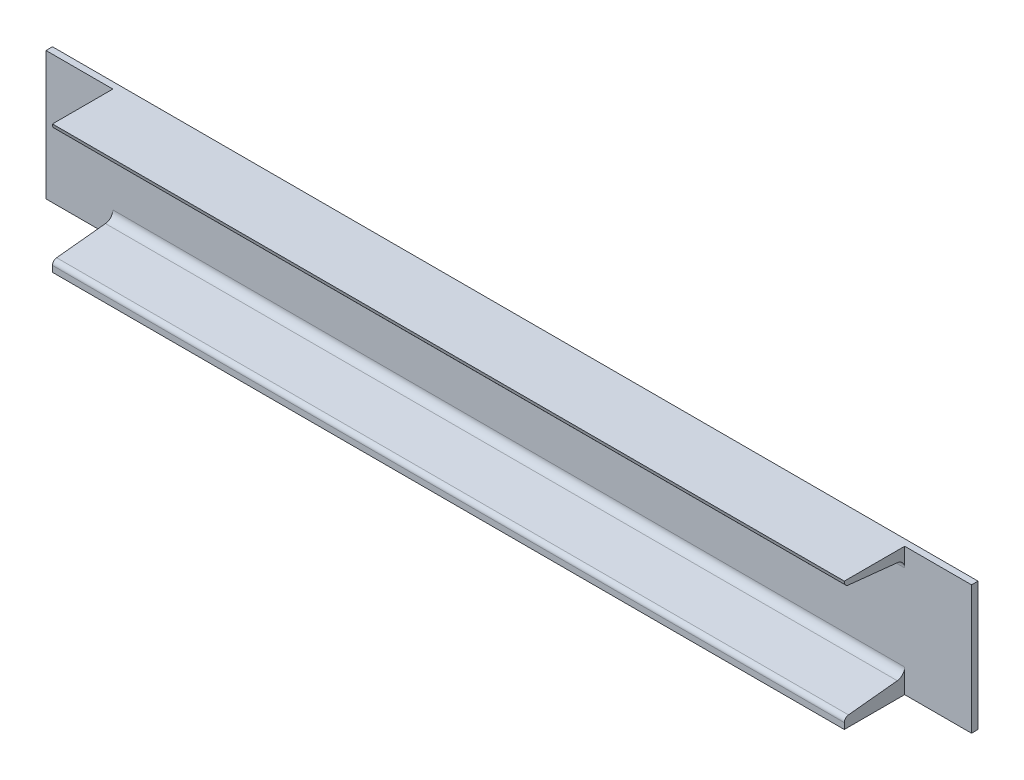
ISO-10303-21;
HEADER;
FILE_DESCRIPTION(('STEP AP214'),'2;1');
FILE_NAME('part.step','',(''),(''),'','','');
FILE_SCHEMA(('AUTOMOTIVE_DESIGN { 1 0 10303 214 1 1 1 1 }'));
ENDSEC;
DATA;
#1=APPLICATION_CONTEXT('core data for automotive mechanical design processes');
#2=APPLICATION_PROTOCOL_DEFINITION('international standard','automotive_design',2000,#1);
#3=PRODUCT_CONTEXT('',#1,'mechanical');
#4=PRODUCT('Part','Part','',(#3));
#5=PRODUCT_RELATED_PRODUCT_CATEGORY('part','',(#4));
#6=PRODUCT_DEFINITION_FORMATION('','',#4);
#7=PRODUCT_DEFINITION_CONTEXT('part definition',#1,'design');
#8=PRODUCT_DEFINITION('design','',#6,#7);
#9=PRODUCT_DEFINITION_SHAPE('','',#8);
#10=(LENGTH_UNIT() NAMED_UNIT(*) SI_UNIT(.MILLI.,.METRE.));
#11=(NAMED_UNIT(*) PLANE_ANGLE_UNIT() SI_UNIT($,.RADIAN.));
#12=(NAMED_UNIT(*) SI_UNIT($,.STERADIAN.) SOLID_ANGLE_UNIT());
#13=UNCERTAINTY_MEASURE_WITH_UNIT(LENGTH_MEASURE(1.E-05),#10,'distance_accuracy_value','');
#14=(GEOMETRIC_REPRESENTATION_CONTEXT(3) GLOBAL_UNCERTAINTY_ASSIGNED_CONTEXT((#13)) GLOBAL_UNIT_ASSIGNED_CONTEXT((#10,
#11,#12)) REPRESENTATION_CONTEXT('',''));
#15=CARTESIAN_POINT('',(0.,0.,0.));
#16=DIRECTION('',(0.,0.,1.));
#17=DIRECTION('',(1.,0.,0.));
#18=AXIS2_PLACEMENT_3D('',#15,#16,#17);
#19=CARTESIAN_POINT('',(-900.,124.164669163818,60.5000000000001));
#20=DIRECTION('',(1.,0.,0.));
#21=DIRECTION('',(0.,0.,-1.));
#22=AXIS2_PLACEMENT_3D('',#19,#20,#21);
#23=CYLINDRICAL_SURFACE('',#22,4.5);
#24=CARTESIAN_POINT('',(-835.,124.164669163818,60.5000000000001));
#25=DIRECTION('',(-1.,0.,0.));
#26=DIRECTION('',(0.,0.,1.));
#27=AXIS2_PLACEMENT_3D('',#24,#25,#26);
#28=CIRCLE('',#27,4.5);
#29=CARTESIAN_POINT('',(-835.,119.689320634661,60.9703780847045));
#30=VERTEX_POINT('',#29);
#31=CARTESIAN_POINT('',(-835.,124.164669163818,65.0000000000001));
#32=VERTEX_POINT('',#31);
#33=EDGE_CURVE('E356',#30,#32,#28,.T.);
#34=ORIENTED_EDGE('',*,*,#33,.F.);
#35=DIRECTION('',(1.,0.,0.));
#36=VECTOR('',#35,1.);
#37=CARTESIAN_POINT('',(-900.,119.689320634661,60.9703780847045));
#38=LINE('',#37,#36);
#39=CARTESIAN_POINT('',(-65.0000000000001,119.689320634661,60.9703780847045));
#40=VERTEX_POINT('',#39);
#41=EDGE_CURVE('E199',#30,#40,#38,.T.);
#42=ORIENTED_EDGE('',*,*,#41,.T.);
#43=CARTESIAN_POINT('',(-65.0000000000001,124.164669163818,60.5));
#44=DIRECTION('',(1.,0.,0.));
#45=DIRECTION('',(0.,0.,-1.));
#46=AXIS2_PLACEMENT_3D('',#43,#44,#45);
#47=CIRCLE('',#46,4.5);
#48=CARTESIAN_POINT('',(-65.0000000000001,124.164669163818,65.));
#49=VERTEX_POINT('',#48);
#50=EDGE_CURVE('E266',#49,#40,#47,.T.);
#51=ORIENTED_EDGE('',*,*,#50,.F.);
#52=DIRECTION('',(1.,0.,0.));
#53=VECTOR('',#52,1.);
#54=CARTESIAN_POINT('',(-900.,124.164669163818,65.0000000000001));
#55=LINE('',#54,#53);
#56=EDGE_CURVE('E86',#32,#49,#55,.T.);
#57=ORIENTED_EDGE('',*,*,#56,.F.);
#58=EDGE_LOOP('',(#34,#42,#51,#57));
#59=FACE_BOUND('',#58,.T.);
#60=ADVANCED_FACE('F79',(#59),#23,.T.);
#61=CARTESIAN_POINT('',(-900.,125.,65.0000000000001));
#62=DIRECTION('',(0.,0.,-1.));
#63=DIRECTION('',(-1.,0.,0.));
#64=AXIS2_PLACEMENT_3D('',#61,#62,#63);
#65=PLANE('',#64);
#66=DIRECTION('',(0.,1.,0.));
#67=VECTOR('',#66,1.);
#68=CARTESIAN_POINT('',(-835.,125.,65.0000000000001));
#69=LINE('',#68,#67);
#70=CARTESIAN_POINT('',(-835.,125.,65.0000000000001));
#71=VERTEX_POINT('',#70);
#72=EDGE_CURVE('E258',#32,#71,#69,.T.);
#73=ORIENTED_EDGE('',*,*,#72,.F.);
#74=ORIENTED_EDGE('',*,*,#56,.T.);
#75=DIRECTION('',(0.,-1.,0.));
#76=VECTOR('',#75,1.);
#77=CARTESIAN_POINT('',(-65.0000000000001,125.,65.));
#78=LINE('',#77,#76);
#79=CARTESIAN_POINT('',(-65.0000000000001,125.,65.));
#80=VERTEX_POINT('',#79);
#81=EDGE_CURVE('E257',#80,#49,#78,.T.);
#82=ORIENTED_EDGE('',*,*,#81,.F.);
#83=DIRECTION('',(1.,0.,0.));
#84=VECTOR('',#83,1.);
#85=CARTESIAN_POINT('',(-900.,125.,65.0000000000001));
#86=LINE('',#85,#84);
#87=EDGE_CURVE('E249',#71,#80,#86,.T.);
#88=ORIENTED_EDGE('',*,*,#87,.F.);
#89=EDGE_LOOP('',(#73,#74,#82,#88));
#90=FACE_BOUND('',#89,.T.);
#91=ADVANCED_FACE('F255',(#90),#65,.F.);
#92=CARTESIAN_POINT('',(-900.,0.,65.0000000000001));
#93=DIRECTION('',(0.,0.,-1.));
#94=DIRECTION('',(0.,1.,0.));
#95=AXIS2_PLACEMENT_3D('',#92,#93,#94);
#96=PLANE('',#95);
#97=DIRECTION('',(0.,1.,0.));
#98=VECTOR('',#97,1.);
#99=CARTESIAN_POINT('',(-835.,0.,65.0000000000001));
#100=LINE('',#99,#98);
#101=CARTESIAN_POINT('',(-835.,0.,65.0000000000001));
#102=VERTEX_POINT('',#101);
#103=CARTESIAN_POINT('',(-835.,5.84533083618209,65.0000000000001));
#104=VERTEX_POINT('',#103);
#105=EDGE_CURVE('E543',#102,#104,#100,.T.);
#106=ORIENTED_EDGE('',*,*,#105,.F.);
#107=DIRECTION('',(1.,0.,0.));
#108=VECTOR('',#107,1.);
#109=CARTESIAN_POINT('',(-900.,0.,65.0000000000001));
#110=LINE('',#109,#108);
#111=CARTESIAN_POINT('',(-65.0000000000001,0.,65.));
#112=VERTEX_POINT('',#111);
#113=EDGE_CURVE('E242',#102,#112,#110,.T.);
#114=ORIENTED_EDGE('',*,*,#113,.T.);
#115=DIRECTION('',(0.,-1.,0.));
#116=VECTOR('',#115,1.);
#117=CARTESIAN_POINT('',(-65.0000000000001,0.,65.));
#118=LINE('',#117,#116);
#119=CARTESIAN_POINT('',(-65.0000000000001,5.84533083618209,65.));
#120=VERTEX_POINT('',#119);
#121=EDGE_CURVE('E290',#120,#112,#118,.T.);
#122=ORIENTED_EDGE('',*,*,#121,.F.);
#123=DIRECTION('',(1.,0.,0.));
#124=VECTOR('',#123,1.);
#125=CARTESIAN_POINT('',(-900.,5.84533083618209,65.0000000000001));
#126=LINE('',#125,#124);
#127=EDGE_CURVE('E240',#104,#120,#126,.T.);
#128=ORIENTED_EDGE('',*,*,#127,.F.);
#129=EDGE_LOOP('',(#106,#114,#122,#128));
#130=FACE_BOUND('',#129,.T.);
#131=ADVANCED_FACE('F318',(#130),#96,.F.);
#132=CARTESIAN_POINT('',(-900.,5.84533083618209,60.5000000000001));
#133=DIRECTION('',(1.,0.,0.));
#134=DIRECTION('',(0.,0.,-1.));
#135=AXIS2_PLACEMENT_3D('',#132,#133,#134);
#136=CYLINDRICAL_SURFACE('',#135,4.5);
#137=CARTESIAN_POINT('',(-835.,5.84533083618209,60.5000000000001));
#138=DIRECTION('',(-1.,0.,0.));
#139=DIRECTION('',(0.,0.,1.));
#140=AXIS2_PLACEMENT_3D('',#137,#138,#139);
#141=CIRCLE('',#140,4.5);
#142=CARTESIAN_POINT('',(-835.,10.3206793653393,60.9703780847045));
#143=VERTEX_POINT('',#142);
#144=EDGE_CURVE('E538',#104,#143,#141,.T.);
#145=ORIENTED_EDGE('',*,*,#144,.F.);
#146=ORIENTED_EDGE('',*,*,#127,.T.);
#147=CARTESIAN_POINT('',(-65.0000000000001,5.84533083618209,60.5));
#148=DIRECTION('',(1.,0.,0.));
#149=DIRECTION('',(0.,0.,-1.));
#150=AXIS2_PLACEMENT_3D('',#147,#148,#149);
#151=CIRCLE('',#150,4.5);
#152=CARTESIAN_POINT('',(-65.0000000000001,10.3206793653393,60.9703780847045));
#153=VERTEX_POINT('',#152);
#154=EDGE_CURVE('E287',#153,#120,#151,.T.);
#155=ORIENTED_EDGE('',*,*,#154,.F.);
#156=DIRECTION('',(1.,0.,0.));
#157=VECTOR('',#156,1.);
#158=CARTESIAN_POINT('',(-900.,10.3206793653393,60.9703780847045));
#159=LINE('',#158,#157);
#160=EDGE_CURVE('E238',#143,#153,#159,.T.);
#161=ORIENTED_EDGE('',*,*,#160,.F.);
#162=EDGE_LOOP('',(#145,#146,#155,#161));
#163=FACE_BOUND('',#162,.T.);
#164=ADVANCED_FACE('F322',(#163),#136,.T.);
#165=CARTESIAN_POINT('',(-900.,15.3138248370538,13.4637722938589));
#166=DIRECTION('',(0.,-0.994521895368274,-0.104528463267647));
#167=DIRECTION('',(0.,0.104528463267647,-0.994521895368274));
#168=AXIS2_PLACEMENT_3D('',#165,#166,#167);
#169=PLANE('',#168);
#170=DIRECTION('',(0.,0.104528463267647,-0.994521895368274));
#171=VECTOR('',#170,1.);
#172=CARTESIAN_POINT('',(-835.,15.3138248370538,13.4637722938589));
#173=LINE('',#172,#171);
#174=CARTESIAN_POINT('',(-835.,15.3138248370538,13.4637722938588));
#175=VERTEX_POINT('',#174);
#176=EDGE_CURVE('E374',#143,#175,#173,.T.);
#177=ORIENTED_EDGE('',*,*,#176,.F.);
#178=ORIENTED_EDGE('',*,*,#160,.T.);
#179=DIRECTION('',(0.,-0.104528463267647,0.994521895368274));
#180=VECTOR('',#179,1.);
#181=CARTESIAN_POINT('',(-65.0000000000001,15.3138248370538,13.4637722938588));
#182=LINE('',#181,#180);
#183=CARTESIAN_POINT('',(-65.0000000000001,15.3138248370538,13.4637722938589));
#184=VERTEX_POINT('',#183);
#185=EDGE_CURVE('E284',#184,#153,#182,.T.);
#186=ORIENTED_EDGE('',*,*,#185,.F.);
#187=DIRECTION('',(1.,0.,0.));
#188=VECTOR('',#187,1.);
#189=CARTESIAN_POINT('',(-900.,15.3138248370538,13.4637722938589));
#190=LINE('',#189,#188);
#191=EDGE_CURVE('E236',#175,#184,#190,.T.);
#192=ORIENTED_EDGE('',*,*,#191,.F.);
#193=EDGE_LOOP('',(#177,#178,#186,#192));
#194=FACE_BOUND('',#193,.T.);
#195=ADVANCED_FACE('F335',(#194),#169,.F.);
#196=CARTESIAN_POINT('',(-900.,23.27,14.3000000000001));
#197=DIRECTION('',(1.,0.,0.));
#198=DIRECTION('',(0.,0.,-1.));
#199=AXIS2_PLACEMENT_3D('',#196,#197,#198);
#200=CYLINDRICAL_SURFACE('',#199,8.);
#201=CARTESIAN_POINT('',(-835.,23.27,14.3000000000001));
#202=DIRECTION('',(-1.,0.,0.));
#203=DIRECTION('',(0.,0.,1.));
#204=AXIS2_PLACEMENT_3D('',#201,#202,#203);
#205=CIRCLE('',#204,8.);
#206=CARTESIAN_POINT('',(-835.,23.27,6.30000000000011));
#207=VERTEX_POINT('',#206);
#208=EDGE_CURVE('E371',#175,#207,#205,.F.);
#209=ORIENTED_EDGE('',*,*,#208,.F.);
#210=ORIENTED_EDGE('',*,*,#191,.T.);
#211=CARTESIAN_POINT('',(-65.0000000000001,23.27,14.3));
#212=DIRECTION('',(1.,0.,0.));
#213=DIRECTION('',(0.,0.,-1.));
#214=AXIS2_PLACEMENT_3D('',#211,#212,#213);
#215=CIRCLE('',#214,8.);
#216=CARTESIAN_POINT('',(-65.,23.27,6.30000000000001));
#217=VERTEX_POINT('',#216);
#218=EDGE_CURVE('E281',#217,#184,#215,.F.);
#219=ORIENTED_EDGE('',*,*,#218,.F.);
#220=DIRECTION('',(1.,0.,0.));
#221=VECTOR('',#220,1.);
#222=CARTESIAN_POINT('',(-900.,23.27,6.30000000000012));
#223=LINE('',#222,#221);
#224=EDGE_CURVE('E234',#207,#217,#223,.T.);
#225=ORIENTED_EDGE('',*,*,#224,.F.);
#226=EDGE_LOOP('',(#209,#210,#219,#225));
#227=FACE_BOUND('',#226,.T.);
#228=ADVANCED_FACE('F339',(#227),#200,.F.);
#229=CARTESIAN_POINT('',(-900.,106.74,14.3000000000001));
#230=DIRECTION('',(1.,0.,0.));
#231=DIRECTION('',(0.,0.,-1.));
#232=AXIS2_PLACEMENT_3D('',#229,#230,#231);
#233=CYLINDRICAL_SURFACE('',#232,8.);
#234=CARTESIAN_POINT('',(-835.,106.74,14.3000000000001));
#235=DIRECTION('',(-1.,0.,0.));
#236=DIRECTION('',(0.,0.,1.));
#237=AXIS2_PLACEMENT_3D('',#234,#235,#236);
#238=CIRCLE('',#237,8.);
#239=CARTESIAN_POINT('',(-835.,106.74,6.3000000000001));
#240=VERTEX_POINT('',#239);
#241=CARTESIAN_POINT('',(-835.,114.696175162946,13.4637722938588));
#242=VERTEX_POINT('',#241);
#243=EDGE_CURVE('E355',#240,#242,#238,.F.);
#244=ORIENTED_EDGE('',*,*,#243,.F.);
#245=DIRECTION('',(1.,0.,0.));
#246=VECTOR('',#245,1.);
#247=CARTESIAN_POINT('',(-900.,106.74,6.30000000000011));
#248=LINE('',#247,#246);
#249=CARTESIAN_POINT('',(-65.0000000000001,106.74,6.30000000000001));
#250=VERTEX_POINT('',#249);
#251=EDGE_CURVE('E232',#240,#250,#248,.T.);
#252=ORIENTED_EDGE('',*,*,#251,.T.);
#253=CARTESIAN_POINT('',(-65.0000000000001,106.74,14.3));
#254=DIRECTION('',(1.,0.,0.));
#255=DIRECTION('',(0.,0.,-1.));
#256=AXIS2_PLACEMENT_3D('',#253,#254,#255);
#257=CIRCLE('',#256,8.);
#258=CARTESIAN_POINT('',(-65.0000000000001,114.696175162946,13.4637722938588));
#259=VERTEX_POINT('',#258);
#260=EDGE_CURVE('E273',#259,#250,#257,.F.);
#261=ORIENTED_EDGE('',*,*,#260,.F.);
#262=DIRECTION('',(1.,0.,0.));
#263=VECTOR('',#262,1.);
#264=CARTESIAN_POINT('',(-900.,114.696175162946,13.4637722938589));
#265=LINE('',#264,#263);
#266=EDGE_CURVE('E230',#242,#259,#265,.T.);
#267=ORIENTED_EDGE('',*,*,#266,.F.);
#268=EDGE_LOOP('',(#244,#252,#261,#267));
#269=FACE_BOUND('',#268,.T.);
#270=ADVANCED_FACE('F342',(#269),#233,.F.);
#271=CARTESIAN_POINT('',(-900.,114.696175162946,13.4637722938589));
#272=DIRECTION('',(0.,0.994521895368274,-0.104528463267646));
#273=DIRECTION('',(0.,0.104528463267646,0.994521895368274));
#274=AXIS2_PLACEMENT_3D('',#271,#272,#273);
#275=PLANE('',#274);
#276=DIRECTION('',(0.,0.104528463267646,0.994521895368274));
#277=VECTOR('',#276,1.);
#278=CARTESIAN_POINT('',(-835.,114.696175162946,13.4637722938589));
#279=LINE('',#278,#277);
#280=EDGE_CURVE('E352',#242,#30,#279,.T.);
#281=ORIENTED_EDGE('',*,*,#280,.F.);
#282=ORIENTED_EDGE('',*,*,#266,.T.);
#283=DIRECTION('',(0.,-0.104528463267646,-0.994521895368274));
#284=VECTOR('',#283,1.);
#285=CARTESIAN_POINT('',(-65.0000000000001,114.696175162946,13.4637722938588));
#286=LINE('',#285,#284);
#287=EDGE_CURVE('E13',#40,#259,#286,.T.);
#288=ORIENTED_EDGE('',*,*,#287,.F.);
#289=ORIENTED_EDGE('',*,*,#41,.F.);
#290=EDGE_LOOP('',(#281,#282,#288,#289));
#291=FACE_BOUND('',#290,.T.);
#292=ADVANCED_FACE('F328',(#291),#275,.F.);
#293=CARTESIAN_POINT('',(-900.,125.,65.0000000000001));
#294=DIRECTION('',(0.,-1.,0.));
#295=DIRECTION('',(0.,0.,-1.));
#296=AXIS2_PLACEMENT_3D('',#293,#294,#295);
#297=PLANE('',#296);
#298=DIRECTION('',(-1.,0.,0.));
#299=VECTOR('',#298,1.);
#300=CARTESIAN_POINT('',(-900.,125.,6.30000000000011));
#301=LINE('',#300,#299);
#302=CARTESIAN_POINT('',(-835.,125.,6.3000000000001));
#303=VERTEX_POINT('',#302);
#304=CARTESIAN_POINT('',(-900.,125.,6.30000000000011));
#305=VERTEX_POINT('',#304);
#306=EDGE_CURVE('E197',#303,#305,#301,.T.);
#307=ORIENTED_EDGE('',*,*,#306,.F.);
#308=DIRECTION('',(0.,0.,-1.));
#309=VECTOR('',#308,1.);
#310=CARTESIAN_POINT('',(-835.,125.,65.0000000000001));
#311=LINE('',#310,#309);
#312=EDGE_CURVE('E370',#71,#303,#311,.T.);
#313=ORIENTED_EDGE('',*,*,#312,.F.);
#314=ORIENTED_EDGE('',*,*,#87,.T.);
#315=DIRECTION('',(0.,0.,1.));
#316=VECTOR('',#315,1.);
#317=CARTESIAN_POINT('',(-65.0000000000001,125.,65.));
#318=LINE('',#317,#316);
#319=CARTESIAN_POINT('',(-65.,125.,6.30000000000001));
#320=VERTEX_POINT('',#319);
#321=EDGE_CURVE('E270',#320,#80,#318,.T.);
#322=ORIENTED_EDGE('',*,*,#321,.F.);
#323=DIRECTION('',(1.,0.,0.));
#324=VECTOR('',#323,1.);
#325=CARTESIAN_POINT('',(-900.,125.,6.30000000000011));
#326=LINE('',#325,#324);
#327=CARTESIAN_POINT('',(0.,125.,6.3));
#328=VERTEX_POINT('',#327);
#329=EDGE_CURVE('E276',#320,#328,#326,.T.);
#330=ORIENTED_EDGE('',*,*,#329,.T.);
#331=DIRECTION('',(0.,0.,-1.));
#332=VECTOR('',#331,1.);
#333=CARTESIAN_POINT('',(0.,125.,65.));
#334=LINE('',#333,#332);
#335=CARTESIAN_POINT('',(0.,125.,0.));
#336=VERTEX_POINT('',#335);
#337=EDGE_CURVE('E220',#328,#336,#334,.T.);
#338=ORIENTED_EDGE('',*,*,#337,.T.);
#339=DIRECTION('',(1.,0.,0.));
#340=VECTOR('',#339,1.);
#341=CARTESIAN_POINT('',(-900.,125.,1.09655276479723E-13));
#342=LINE('',#341,#340);
#343=CARTESIAN_POINT('',(-900.,125.,1.09655276479723E-13));
#344=VERTEX_POINT('',#343);
#345=EDGE_CURVE('E246',#344,#336,#342,.T.);
#346=ORIENTED_EDGE('',*,*,#345,.F.);
#347=DIRECTION('',(0.,0.,-1.));
#348=VECTOR('',#347,1.);
#349=CARTESIAN_POINT('',(-900.,125.,65.0000000000001));
#350=LINE('',#349,#348);
#351=EDGE_CURVE('E216',#305,#344,#350,.T.);
#352=ORIENTED_EDGE('',*,*,#351,.F.);
#353=EDGE_LOOP('',(#307,#313,#314,#322,#330,#338,#346,#352));
#354=FACE_BOUND('',#353,.T.);
#355=ADVANCED_FACE('F295',(#354),#297,.F.);
#356=CARTESIAN_POINT('',(-900.,0.,65.0000000000001));
#357=DIRECTION('',(0.,1.,0.));
#358=DIRECTION('',(0.,0.,1.));
#359=AXIS2_PLACEMENT_3D('',#356,#357,#358);
#360=PLANE('',#359);
#361=DIRECTION('',(1.,0.,0.));
#362=VECTOR('',#361,1.);
#363=CARTESIAN_POINT('',(-900.,0.,6.30000000000011));
#364=LINE('',#363,#362);
#365=CARTESIAN_POINT('',(-900.,0.,6.30000000000011));
#366=VERTEX_POINT('',#365);
#367=CARTESIAN_POINT('',(-835.,0.,6.30000000000011));
#368=VERTEX_POINT('',#367);
#369=EDGE_CURVE('E193',#366,#368,#364,.T.);
#370=ORIENTED_EDGE('',*,*,#369,.F.);
#371=DIRECTION('',(0.,0.,1.));
#372=VECTOR('',#371,1.);
#373=CARTESIAN_POINT('',(-900.,0.,65.0000000000001));
#374=LINE('',#373,#372);
#375=CARTESIAN_POINT('',(-900.,0.,1.10218211923262E-13));
#376=VERTEX_POINT('',#375);
#377=EDGE_CURVE('E200',#376,#366,#374,.T.);
#378=ORIENTED_EDGE('',*,*,#377,.F.);
#379=DIRECTION('',(1.,0.,0.));
#380=VECTOR('',#379,1.);
#381=CARTESIAN_POINT('',(-900.,0.,1.10218211923262E-13));
#382=LINE('',#381,#380);
#383=CARTESIAN_POINT('',(0.,0.,0.));
#384=VERTEX_POINT('',#383);
#385=EDGE_CURVE('E244',#376,#384,#382,.T.);
#386=ORIENTED_EDGE('',*,*,#385,.T.);
#387=DIRECTION('',(0.,0.,1.));
#388=VECTOR('',#387,1.);
#389=CARTESIAN_POINT('',(0.,0.,65.));
#390=LINE('',#389,#388);
#391=CARTESIAN_POINT('',(0.,0.,6.3));
#392=VERTEX_POINT('',#391);
#393=EDGE_CURVE('E225',#384,#392,#390,.T.);
#394=ORIENTED_EDGE('',*,*,#393,.T.);
#395=DIRECTION('',(-1.,0.,0.));
#396=VECTOR('',#395,1.);
#397=CARTESIAN_POINT('',(-900.,0.,6.30000000000011));
#398=LINE('',#397,#396);
#399=CARTESIAN_POINT('',(-65.,0.,6.30000000000001));
#400=VERTEX_POINT('',#399);
#401=EDGE_CURVE('E366',#392,#400,#398,.T.);
#402=ORIENTED_EDGE('',*,*,#401,.T.);
#403=DIRECTION('',(0.,0.,-1.));
#404=VECTOR('',#403,1.);
#405=CARTESIAN_POINT('',(-65.0000000000001,0.,65.));
#406=LINE('',#405,#404);
#407=EDGE_CURVE('E223',#112,#400,#406,.T.);
#408=ORIENTED_EDGE('',*,*,#407,.F.);
#409=ORIENTED_EDGE('',*,*,#113,.F.);
#410=DIRECTION('',(0.,0.,1.));
#411=VECTOR('',#410,1.);
#412=CARTESIAN_POINT('',(-835.,0.,65.0000000000001));
#413=LINE('',#412,#411);
#414=EDGE_CURVE('E208',#368,#102,#413,.T.);
#415=ORIENTED_EDGE('',*,*,#414,.F.);
#416=EDGE_LOOP('',(#370,#378,#386,#394,#402,#408,#409,#415));
#417=FACE_BOUND('',#416,.T.);
#418=ADVANCED_FACE('F205',(#417),#360,.F.);
#419=CARTESIAN_POINT('',(-900.,124.164669163818,60.5000000000001));
#420=DIRECTION('',(-1.,0.,0.));
#421=DIRECTION('',(0.,0.,1.));
#422=AXIS2_PLACEMENT_3D('',#419,#420,#421);
#423=PLANE('',#422);
#424=ORIENTED_EDGE('',*,*,#377,.T.);
#425=DIRECTION('',(0.,1.,0.));
#426=VECTOR('',#425,1.);
#427=CARTESIAN_POINT('',(-900.,106.74,6.30000000000011));
#428=LINE('',#427,#426);
#429=EDGE_CURVE('E93',#366,#305,#428,.T.);
#430=ORIENTED_EDGE('',*,*,#429,.T.);
#431=ORIENTED_EDGE('',*,*,#351,.T.);
#432=DIRECTION('',(0.,-1.,0.));
#433=VECTOR('',#432,1.);
#434=CARTESIAN_POINT('',(-900.,125.,1.09655276479723E-13));
#435=LINE('',#434,#433);
#436=EDGE_CURVE('E213',#344,#376,#435,.T.);
#437=ORIENTED_EDGE('',*,*,#436,.T.);
#438=EDGE_LOOP('',(#424,#430,#431,#437));
#439=FACE_BOUND('',#438,.T.);
#440=ADVANCED_FACE('F211',(#439),#423,.T.);
#441=CARTESIAN_POINT('',(-900.,125.,1.09655276479723E-13));
#442=DIRECTION('',(0.,0.,1.));
#443=DIRECTION('',(1.,0.,0.));
#444=AXIS2_PLACEMENT_3D('',#441,#442,#443);
#445=PLANE('',#444);
#446=DIRECTION('',(0.,-1.,0.));
#447=VECTOR('',#446,1.);
#448=CARTESIAN_POINT('',(0.,125.,0.));
#449=LINE('',#448,#447);
#450=EDGE_CURVE('E222',#336,#384,#449,.T.);
#451=ORIENTED_EDGE('',*,*,#450,.T.);
#452=ORIENTED_EDGE('',*,*,#385,.F.);
#453=ORIENTED_EDGE('',*,*,#436,.F.);
#454=ORIENTED_EDGE('',*,*,#345,.T.);
#455=EDGE_LOOP('',(#451,#452,#453,#454));
#456=FACE_BOUND('',#455,.T.);
#457=ADVANCED_FACE('F299',(#456),#445,.F.);
#458=CARTESIAN_POINT('',(-900.,106.74,6.30000000000011));
#459=DIRECTION('',(0.,0.,-1.));
#460=DIRECTION('',(0.,1.,0.));
#461=AXIS2_PLACEMENT_3D('',#458,#459,#460);
#462=PLANE('',#461);
#463=ORIENTED_EDGE('',*,*,#429,.F.);
#464=ORIENTED_EDGE('',*,*,#369,.T.);
#465=DIRECTION('',(0.,1.,0.));
#466=VECTOR('',#465,1.);
#467=CARTESIAN_POINT('',(-835.,-13.8725320723683,6.30000000000011));
#468=LINE('',#467,#466);
#469=EDGE_CURVE('E209',#368,#207,#468,.T.);
#470=ORIENTED_EDGE('',*,*,#469,.T.);
#471=ORIENTED_EDGE('',*,*,#224,.T.);
#472=DIRECTION('',(0.,1.,0.));
#473=VECTOR('',#472,1.);
#474=CARTESIAN_POINT('',(-65.,-13.8725320723683,6.30000000000001));
#475=LINE('',#474,#473);
#476=EDGE_CURVE('E363',#400,#217,#475,.T.);
#477=ORIENTED_EDGE('',*,*,#476,.F.);
#478=ORIENTED_EDGE('',*,*,#401,.F.);
#479=DIRECTION('',(0.,1.,0.));
#480=VECTOR('',#479,1.);
#481=CARTESIAN_POINT('',(0.,106.74,6.3));
#482=LINE('',#481,#480);
#483=EDGE_CURVE('E101',#392,#328,#482,.T.);
#484=ORIENTED_EDGE('',*,*,#483,.T.);
#485=ORIENTED_EDGE('',*,*,#329,.F.);
#486=EDGE_CURVE('E362',#250,#320,#475,.T.);
#487=ORIENTED_EDGE('',*,*,#486,.F.);
#488=ORIENTED_EDGE('',*,*,#251,.F.);
#489=EDGE_CURVE('E531',#240,#303,#468,.T.);
#490=ORIENTED_EDGE('',*,*,#489,.T.);
#491=ORIENTED_EDGE('',*,*,#306,.T.);
#492=EDGE_LOOP('',(#463,#464,#470,#471,#477,#478,#484,#485,#487,#488,#490,#491));
#493=FACE_BOUND('',#492,.T.);
#494=ADVANCED_FACE('F191',(#493),#462,.F.);
#495=CARTESIAN_POINT('',(0.,124.164669163818,60.5));
#496=DIRECTION('',(-1.,0.,0.));
#497=DIRECTION('',(0.,0.,1.));
#498=AXIS2_PLACEMENT_3D('',#495,#496,#497);
#499=PLANE('',#498);
#500=ORIENTED_EDGE('',*,*,#337,.F.);
#501=ORIENTED_EDGE('',*,*,#483,.F.);
#502=ORIENTED_EDGE('',*,*,#393,.F.);
#503=ORIENTED_EDGE('',*,*,#450,.F.);
#504=EDGE_LOOP('',(#500,#501,#502,#503));
#505=FACE_BOUND('',#504,.T.);
#506=ADVANCED_FACE('F301',(#505),#499,.F.);
#507=CARTESIAN_POINT('',(-65.,0.,0.));
#508=DIRECTION('',(1.,0.,0.));
#509=DIRECTION('',(0.,0.,-1.));
#510=AXIS2_PLACEMENT_3D('',#507,#508,#509);
#511=PLANE('',#510);
#512=ORIENTED_EDGE('',*,*,#407,.T.);
#513=ORIENTED_EDGE('',*,*,#476,.T.);
#514=ORIENTED_EDGE('',*,*,#218,.T.);
#515=ORIENTED_EDGE('',*,*,#185,.T.);
#516=ORIENTED_EDGE('',*,*,#154,.T.);
#517=ORIENTED_EDGE('',*,*,#121,.T.);
#518=EDGE_LOOP('',(#512,#513,#514,#515,#516,#517));
#519=FACE_BOUND('',#518,.T.);
#520=ADVANCED_FACE('F303',(#519),#511,.T.);
#521=ORIENTED_EDGE('',*,*,#321,.T.);
#522=ORIENTED_EDGE('',*,*,#81,.T.);
#523=ORIENTED_EDGE('',*,*,#50,.T.);
#524=ORIENTED_EDGE('',*,*,#287,.T.);
#525=ORIENTED_EDGE('',*,*,#260,.T.);
#526=ORIENTED_EDGE('',*,*,#486,.T.);
#527=EDGE_LOOP('',(#521,#522,#523,#524,#525,#526));
#528=FACE_BOUND('',#527,.T.);
#529=ADVANCED_FACE('F265',(#528),#511,.T.);
#530=CARTESIAN_POINT('',(-835.,0.,1.02258007728804E-13));
#531=DIRECTION('',(-1.,0.,0.));
#532=DIRECTION('',(0.,0.,-1.));
#533=AXIS2_PLACEMENT_3D('',#530,#531,#532);
#534=PLANE('',#533);
#535=ORIENTED_EDGE('',*,*,#243,.T.);
#536=ORIENTED_EDGE('',*,*,#280,.T.);
#537=ORIENTED_EDGE('',*,*,#33,.T.);
#538=ORIENTED_EDGE('',*,*,#72,.T.);
#539=ORIENTED_EDGE('',*,*,#312,.T.);
#540=ORIENTED_EDGE('',*,*,#489,.F.);
#541=EDGE_LOOP('',(#535,#536,#537,#538,#539,#540));
#542=FACE_BOUND('',#541,.T.);
#543=ADVANCED_FACE('F378',(#542),#534,.T.);
#544=ORIENTED_EDGE('',*,*,#208,.T.);
#545=ORIENTED_EDGE('',*,*,#469,.F.);
#546=ORIENTED_EDGE('',*,*,#414,.T.);
#547=ORIENTED_EDGE('',*,*,#105,.T.);
#548=ORIENTED_EDGE('',*,*,#144,.T.);
#549=ORIENTED_EDGE('',*,*,#176,.T.);
#550=EDGE_LOOP('',(#544,#545,#546,#547,#548,#549));
#551=FACE_BOUND('',#550,.T.);
#552=ADVANCED_FACE('F380',(#551),#534,.T.);
#553=CLOSED_SHELL('',(#60,#91,#131,#164,#195,#228,#270,#292,#355,#418,#440,#457,#494,#506,#520,
#529,#543,#552));
#554=MANIFOLD_SOLID_BREP('B2',#553);
#555=ADVANCED_BREP_SHAPE_REPRESENTATION('',(#18,#554),#14);
#556=SHAPE_DEFINITION_REPRESENTATION(#9,#555);
ENDSEC;
END-ISO-10303-21;
